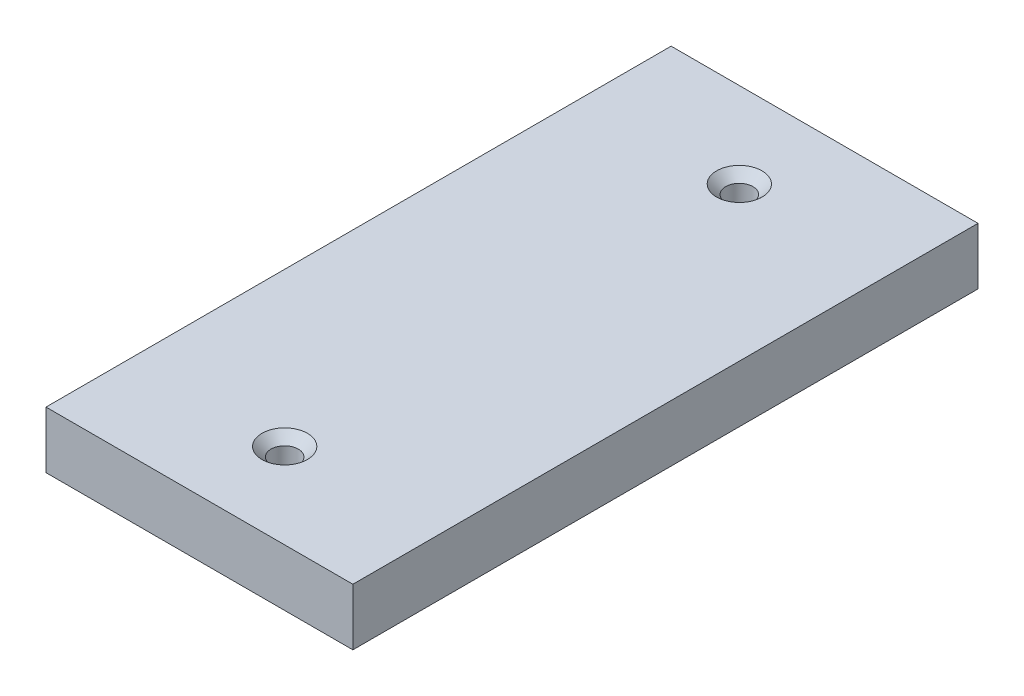
ISO-10303-21;
HEADER;
FILE_DESCRIPTION(('STEP AP214'),'2;1');
FILE_NAME('part.step','',(''),(''),'','','');
FILE_SCHEMA(('AUTOMOTIVE_DESIGN { 1 0 10303 214 1 1 1 1 }'));
ENDSEC;
DATA;
#1=APPLICATION_CONTEXT('core data for automotive mechanical design processes');
#2=APPLICATION_PROTOCOL_DEFINITION('international standard','automotive_design',2000,#1);
#3=PRODUCT_CONTEXT('',#1,'mechanical');
#4=PRODUCT('Part','Part','',(#3));
#5=PRODUCT_RELATED_PRODUCT_CATEGORY('part','',(#4));
#6=PRODUCT_DEFINITION_FORMATION('','',#4);
#7=PRODUCT_DEFINITION_CONTEXT('part definition',#1,'design');
#8=PRODUCT_DEFINITION('design','',#6,#7);
#9=PRODUCT_DEFINITION_SHAPE('','',#8);
#10=(LENGTH_UNIT() NAMED_UNIT(*) SI_UNIT(.MILLI.,.METRE.));
#11=(NAMED_UNIT(*) PLANE_ANGLE_UNIT() SI_UNIT($,.RADIAN.));
#12=(NAMED_UNIT(*) SI_UNIT($,.STERADIAN.) SOLID_ANGLE_UNIT());
#13=UNCERTAINTY_MEASURE_WITH_UNIT(LENGTH_MEASURE(1.E-05),#10,'distance_accuracy_value','');
#14=(GEOMETRIC_REPRESENTATION_CONTEXT(3) GLOBAL_UNCERTAINTY_ASSIGNED_CONTEXT((#13)) GLOBAL_UNIT_ASSIGNED_CONTEXT((#10,
#11,#12)) REPRESENTATION_CONTEXT('',''));
#15=CARTESIAN_POINT('',(0.,0.,0.));
#16=DIRECTION('',(0.,0.,1.));
#17=DIRECTION('',(1.,0.,0.));
#18=AXIS2_PLACEMENT_3D('',#15,#16,#17);
#19=CARTESIAN_POINT('',(27.,5.,55.));
#20=DIRECTION('',(-1.,0.,0.));
#21=DIRECTION('',(0.,0.,1.));
#22=AXIS2_PLACEMENT_3D('',#19,#20,#21);
#23=PLANE('',#22);
#24=DIRECTION('',(0.,0.,-1.));
#25=VECTOR('',#24,1.);
#26=CARTESIAN_POINT('',(27.,-5.,55.));
#27=LINE('',#26,#25);
#28=CARTESIAN_POINT('',(27.,-5.,55.));
#29=VERTEX_POINT('',#28);
#30=CARTESIAN_POINT('',(27.,-5.,-55.));
#31=VERTEX_POINT('',#30);
#32=EDGE_CURVE('E107',#29,#31,#27,.T.);
#33=ORIENTED_EDGE('',*,*,#32,.T.);
#34=DIRECTION('',(0.,-1.,0.));
#35=VECTOR('',#34,1.);
#36=CARTESIAN_POINT('',(27.,5.,-55.));
#37=LINE('',#36,#35);
#38=CARTESIAN_POINT('',(27.,5.,-55.));
#39=VERTEX_POINT('',#38);
#40=EDGE_CURVE('E98',#39,#31,#37,.T.);
#41=ORIENTED_EDGE('',*,*,#40,.F.);
#42=DIRECTION('',(0.,0.,-1.));
#43=VECTOR('',#42,1.);
#44=CARTESIAN_POINT('',(27.,5.,55.));
#45=LINE('',#44,#43);
#46=CARTESIAN_POINT('',(27.,5.,55.));
#47=VERTEX_POINT('',#46);
#48=EDGE_CURVE('E92',#47,#39,#45,.T.);
#49=ORIENTED_EDGE('',*,*,#48,.F.);
#50=DIRECTION('',(0.,-1.,0.));
#51=VECTOR('',#50,1.);
#52=CARTESIAN_POINT('',(27.,5.,55.));
#53=LINE('',#52,#51);
#54=EDGE_CURVE('E103',#47,#29,#53,.T.);
#55=ORIENTED_EDGE('',*,*,#54,.T.);
#56=EDGE_LOOP('',(#33,#41,#49,#55));
#57=FACE_BOUND('',#56,.T.);
#58=ADVANCED_FACE('F38',(#57),#23,.F.);
#59=CARTESIAN_POINT('',(-27.,5.,-55.));
#60=DIRECTION('',(0.,0.,1.));
#61=DIRECTION('',(1.,0.,0.));
#62=AXIS2_PLACEMENT_3D('',#59,#60,#61);
#63=PLANE('',#62);
#64=DIRECTION('',(-1.,0.,0.));
#65=VECTOR('',#64,1.);
#66=CARTESIAN_POINT('',(-27.,-5.,-55.));
#67=LINE('',#66,#65);
#68=CARTESIAN_POINT('',(-27.,-5.,-55.));
#69=VERTEX_POINT('',#68);
#70=EDGE_CURVE('E97',#31,#69,#67,.T.);
#71=ORIENTED_EDGE('',*,*,#70,.T.);
#72=DIRECTION('',(0.,-1.,0.));
#73=VECTOR('',#72,1.);
#74=CARTESIAN_POINT('',(-27.,5.,-55.));
#75=LINE('',#74,#73);
#76=CARTESIAN_POINT('',(-27.,5.,-55.));
#77=VERTEX_POINT('',#76);
#78=EDGE_CURVE('E95',#77,#69,#75,.T.);
#79=ORIENTED_EDGE('',*,*,#78,.F.);
#80=DIRECTION('',(-1.,0.,0.));
#81=VECTOR('',#80,1.);
#82=CARTESIAN_POINT('',(-27.,5.,-55.));
#83=LINE('',#82,#81);
#84=EDGE_CURVE('E87',#39,#77,#83,.T.);
#85=ORIENTED_EDGE('',*,*,#84,.F.);
#86=ORIENTED_EDGE('',*,*,#40,.T.);
#87=EDGE_LOOP('',(#71,#79,#85,#86));
#88=FACE_BOUND('',#87,.T.);
#89=ADVANCED_FACE('F96',(#88),#63,.F.);
#90=CARTESIAN_POINT('',(-27.,5.,55.));
#91=DIRECTION('',(1.,0.,0.));
#92=DIRECTION('',(0.,0.,-1.));
#93=AXIS2_PLACEMENT_3D('',#90,#91,#92);
#94=PLANE('',#93);
#95=DIRECTION('',(0.,0.,1.));
#96=VECTOR('',#95,1.);
#97=CARTESIAN_POINT('',(-27.,-5.,55.));
#98=LINE('',#97,#96);
#99=CARTESIAN_POINT('',(-27.,-5.,55.));
#100=VERTEX_POINT('',#99);
#101=EDGE_CURVE('E73',#69,#100,#98,.T.);
#102=ORIENTED_EDGE('',*,*,#101,.T.);
#103=DIRECTION('',(0.,-1.,0.));
#104=VECTOR('',#103,1.);
#105=CARTESIAN_POINT('',(-27.,5.,55.));
#106=LINE('',#105,#104);
#107=CARTESIAN_POINT('',(-27.,5.,55.));
#108=VERTEX_POINT('',#107);
#109=EDGE_CURVE('E99',#108,#100,#106,.T.);
#110=ORIENTED_EDGE('',*,*,#109,.F.);
#111=DIRECTION('',(0.,0.,1.));
#112=VECTOR('',#111,1.);
#113=CARTESIAN_POINT('',(-27.,5.,55.));
#114=LINE('',#113,#112);
#115=EDGE_CURVE('E90',#77,#108,#114,.T.);
#116=ORIENTED_EDGE('',*,*,#115,.F.);
#117=ORIENTED_EDGE('',*,*,#78,.T.);
#118=EDGE_LOOP('',(#102,#110,#116,#117));
#119=FACE_BOUND('',#118,.T.);
#120=ADVANCED_FACE('F101',(#119),#94,.F.);
#121=CARTESIAN_POINT('',(-27.,5.,55.));
#122=DIRECTION('',(0.,0.,-1.));
#123=DIRECTION('',(-1.,0.,0.));
#124=AXIS2_PLACEMENT_3D('',#121,#122,#123);
#125=PLANE('',#124);
#126=DIRECTION('',(1.,0.,0.));
#127=VECTOR('',#126,1.);
#128=CARTESIAN_POINT('',(-27.,-5.,55.));
#129=LINE('',#128,#127);
#130=EDGE_CURVE('E79',#100,#29,#129,.T.);
#131=ORIENTED_EDGE('',*,*,#130,.T.);
#132=ORIENTED_EDGE('',*,*,#54,.F.);
#133=DIRECTION('',(1.,0.,0.));
#134=VECTOR('',#133,1.);
#135=CARTESIAN_POINT('',(-27.,5.,55.));
#136=LINE('',#135,#134);
#137=EDGE_CURVE('E56',#108,#47,#136,.T.);
#138=ORIENTED_EDGE('',*,*,#137,.F.);
#139=ORIENTED_EDGE('',*,*,#109,.T.);
#140=EDGE_LOOP('',(#131,#132,#138,#139));
#141=FACE_BOUND('',#140,.T.);
#142=ADVANCED_FACE('F168',(#141),#125,.F.);
#143=CARTESIAN_POINT('',(0.,5.,0.));
#144=DIRECTION('',(0.,-1.,0.));
#145=DIRECTION('',(0.,0.,-1.));
#146=AXIS2_PLACEMENT_3D('',#143,#144,#145);
#147=PLANE('',#146);
#148=CARTESIAN_POINT('',(0.,5.,40.));
#149=DIRECTION('',(0.,-1.,0.));
#150=DIRECTION('',(0.,0.,-1.));
#151=AXIS2_PLACEMENT_3D('',#148,#149,#150);
#152=CIRCLE('',#151,4.00000000000002);
#153=CARTESIAN_POINT('',(0.,5.,36.));
#154=VERTEX_POINT('',#153);
#155=EDGE_CURVE('E48',#154,#154,#152,.T.);
#156=ORIENTED_EDGE('',*,*,#155,.T.);
#157=EDGE_LOOP('',(#156));
#158=FACE_BOUND('',#157,.T.);
#159=CARTESIAN_POINT('',(0.,5.,-40.));
#160=DIRECTION('',(0.,-1.,0.));
#161=DIRECTION('',(0.,0.,-1.));
#162=AXIS2_PLACEMENT_3D('',#159,#160,#161);
#163=CIRCLE('',#162,4.00000000000002);
#164=CARTESIAN_POINT('',(0.,5.,-44.));
#165=VERTEX_POINT('',#164);
#166=EDGE_CURVE('E120',#165,#165,#163,.T.);
#167=ORIENTED_EDGE('',*,*,#166,.T.);
#168=EDGE_LOOP('',(#167));
#169=FACE_BOUND('',#168,.T.);
#170=ORIENTED_EDGE('',*,*,#48,.T.);
#171=ORIENTED_EDGE('',*,*,#84,.T.);
#172=ORIENTED_EDGE('',*,*,#115,.T.);
#173=ORIENTED_EDGE('',*,*,#137,.T.);
#174=EDGE_LOOP('',(#170,#171,#172,#173));
#175=FACE_BOUND('',#174,.T.);
#176=ADVANCED_FACE('F88',(#158,#169,#175),#147,.F.);
#177=CARTESIAN_POINT('',(0.,-5.,0.));
#178=DIRECTION('',(0.,-1.,0.));
#179=DIRECTION('',(0.,0.,-1.));
#180=AXIS2_PLACEMENT_3D('',#177,#178,#179);
#181=PLANE('',#180);
#182=CARTESIAN_POINT('',(0.,-5.,-40.));
#183=DIRECTION('',(0.,-1.,0.));
#184=DIRECTION('',(0.,0.,-1.));
#185=AXIS2_PLACEMENT_3D('',#182,#183,#184);
#186=CIRCLE('',#185,2.4);
#187=CARTESIAN_POINT('',(0.,-5.,-42.4));
#188=VERTEX_POINT('',#187);
#189=EDGE_CURVE('E110',#188,#188,#186,.F.);
#190=ORIENTED_EDGE('',*,*,#189,.T.);
#191=EDGE_LOOP('',(#190));
#192=FACE_BOUND('',#191,.T.);
#193=CARTESIAN_POINT('',(0.,-5.,40.));
#194=DIRECTION('',(0.,-1.,0.));
#195=DIRECTION('',(0.,0.,-1.));
#196=AXIS2_PLACEMENT_3D('',#193,#194,#195);
#197=CIRCLE('',#196,2.4);
#198=CARTESIAN_POINT('',(0.,-5.,37.6));
#199=VERTEX_POINT('',#198);
#200=EDGE_CURVE('E140',#199,#199,#197,.F.);
#201=ORIENTED_EDGE('',*,*,#200,.T.);
#202=EDGE_LOOP('',(#201));
#203=FACE_BOUND('',#202,.T.);
#204=ORIENTED_EDGE('',*,*,#32,.F.);
#205=ORIENTED_EDGE('',*,*,#130,.F.);
#206=ORIENTED_EDGE('',*,*,#101,.F.);
#207=ORIENTED_EDGE('',*,*,#70,.F.);
#208=EDGE_LOOP('',(#204,#205,#206,#207));
#209=FACE_BOUND('',#208,.T.);
#210=ADVANCED_FACE('F136',(#192,#203,#209),#181,.T.);
#211=CARTESIAN_POINT('',(0.,-5.001,40.));
#212=DIRECTION('',(0.,1.,0.));
#213=DIRECTION('',(0.,0.,1.));
#214=AXIS2_PLACEMENT_3D('',#211,#212,#213);
#215=CYLINDRICAL_SURFACE('',#214,2.4);
#216=CARTESIAN_POINT('',(0.,3.39999999999999,40.));
#217=DIRECTION('',(0.,-1.,0.));
#218=DIRECTION('',(0.,0.,-1.));
#219=AXIS2_PLACEMENT_3D('',#216,#217,#218);
#220=CIRCLE('',#219,2.4);
#221=CARTESIAN_POINT('',(0.,3.39999999999999,37.6));
#222=VERTEX_POINT('',#221);
#223=EDGE_CURVE('E117',#222,#222,#220,.F.);
#224=ORIENTED_EDGE('',*,*,#223,.T.);
#225=EDGE_LOOP('',(#224));
#226=FACE_BOUND('',#225,.T.);
#227=ORIENTED_EDGE('',*,*,#200,.F.);
#228=EDGE_LOOP('',(#227));
#229=FACE_BOUND('',#228,.T.);
#230=ADVANCED_FACE('F133',(#226,#229),#215,.F.);
#231=CARTESIAN_POINT('',(0.,-5.001,-40.));
#232=DIRECTION('',(0.,1.,0.));
#233=DIRECTION('',(0.,0.,1.));
#234=AXIS2_PLACEMENT_3D('',#231,#232,#233);
#235=CYLINDRICAL_SURFACE('',#234,2.4);
#236=CARTESIAN_POINT('',(0.,3.39999999999999,-40.));
#237=DIRECTION('',(0.,-1.,0.));
#238=DIRECTION('',(0.,0.,-1.));
#239=AXIS2_PLACEMENT_3D('',#236,#237,#238);
#240=CIRCLE('',#239,2.4);
#241=CARTESIAN_POINT('',(0.,3.39999999999999,-42.4));
#242=VERTEX_POINT('',#241);
#243=EDGE_CURVE('E11',#242,#242,#240,.F.);
#244=ORIENTED_EDGE('',*,*,#243,.T.);
#245=EDGE_LOOP('',(#244));
#246=FACE_BOUND('',#245,.T.);
#247=ORIENTED_EDGE('',*,*,#189,.F.);
#248=EDGE_LOOP('',(#247));
#249=FACE_BOUND('',#248,.T.);
#250=ADVANCED_FACE('F130',(#246,#249),#235,.F.);
#251=CARTESIAN_POINT('',(0.,3.39999999999999,40.));
#252=DIRECTION('',(0.,1.,0.));
#253=DIRECTION('',(0.,0.,1.));
#254=AXIS2_PLACEMENT_3D('',#251,#252,#253);
#255=CONICAL_SURFACE('',#254,2.4,0.78539816339745);
#256=ORIENTED_EDGE('',*,*,#155,.F.);
#257=EDGE_LOOP('',(#256));
#258=FACE_BOUND('',#257,.T.);
#259=ORIENTED_EDGE('',*,*,#223,.F.);
#260=EDGE_LOOP('',(#259));
#261=FACE_BOUND('',#260,.T.);
#262=ADVANCED_FACE('F127',(#258,#261),#255,.F.);
#263=CARTESIAN_POINT('',(0.,3.39999999999999,-40.));
#264=DIRECTION('',(0.,1.,0.));
#265=DIRECTION('',(0.,0.,1.));
#266=AXIS2_PLACEMENT_3D('',#263,#264,#265);
#267=CONICAL_SURFACE('',#266,2.4,0.78539816339745);
#268=ORIENTED_EDGE('',*,*,#166,.F.);
#269=EDGE_LOOP('',(#268));
#270=FACE_BOUND('',#269,.T.);
#271=ORIENTED_EDGE('',*,*,#243,.F.);
#272=EDGE_LOOP('',(#271));
#273=FACE_BOUND('',#272,.T.);
#274=ADVANCED_FACE('F41',(#270,#273),#267,.F.);
#275=CLOSED_SHELL('',(#58,#89,#120,#142,#176,#210,#230,#250,#262,#274));
#276=MANIFOLD_SOLID_BREP('B2',#275);
#277=ADVANCED_BREP_SHAPE_REPRESENTATION('',(#18,#276),#14);
#278=SHAPE_DEFINITION_REPRESENTATION(#9,#277);
ENDSEC;
END-ISO-10303-21;
